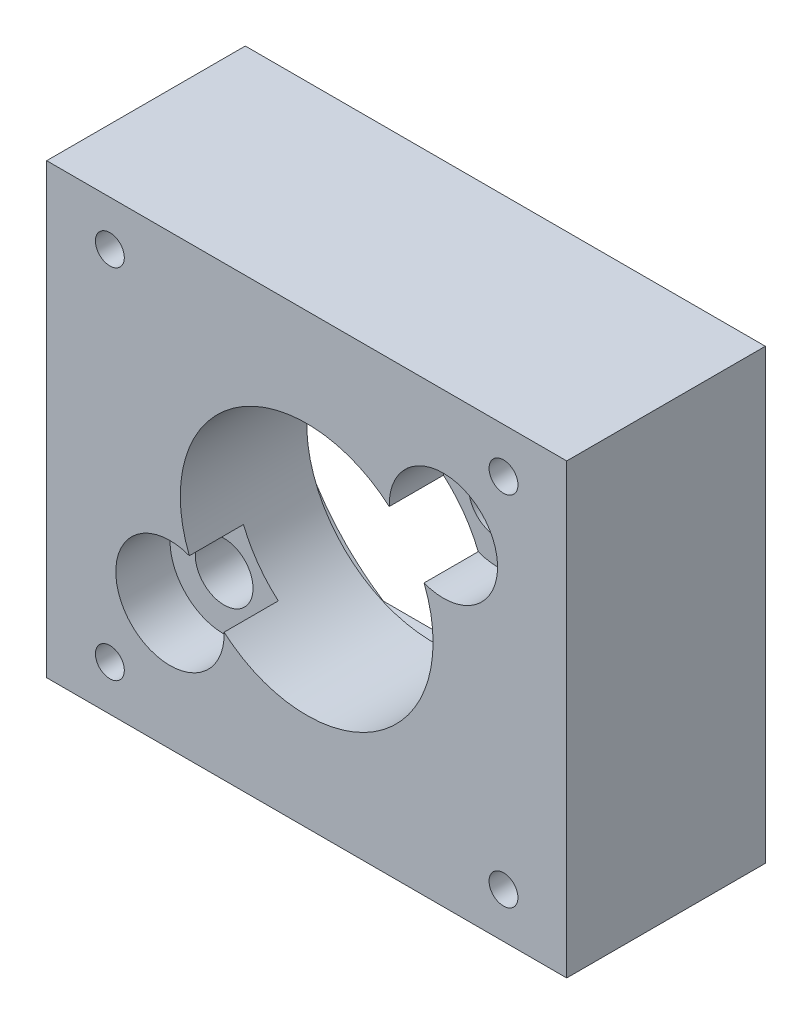
ISO-10303-21;
HEADER;
FILE_DESCRIPTION(('STEP AP214'),'2;1');
FILE_NAME('part.step','',(''),(''),'','','');
FILE_SCHEMA(('AUTOMOTIVE_DESIGN { 1 0 10303 214 1 1 1 1 }'));
ENDSEC;
DATA;
#1=APPLICATION_CONTEXT('core data for automotive mechanical design processes');
#2=APPLICATION_PROTOCOL_DEFINITION('international standard','automotive_design',2000,#1);
#3=PRODUCT_CONTEXT('',#1,'mechanical');
#4=PRODUCT('Part','Part','',(#3));
#5=PRODUCT_RELATED_PRODUCT_CATEGORY('part','',(#4));
#6=PRODUCT_DEFINITION_FORMATION('','',#4);
#7=PRODUCT_DEFINITION_CONTEXT('part definition',#1,'design');
#8=PRODUCT_DEFINITION('design','',#6,#7);
#9=PRODUCT_DEFINITION_SHAPE('','',#8);
#10=(LENGTH_UNIT() NAMED_UNIT(*) SI_UNIT(.MILLI.,.METRE.));
#11=(NAMED_UNIT(*) PLANE_ANGLE_UNIT() SI_UNIT($,.RADIAN.));
#12=(NAMED_UNIT(*) SI_UNIT($,.STERADIAN.) SOLID_ANGLE_UNIT());
#13=UNCERTAINTY_MEASURE_WITH_UNIT(LENGTH_MEASURE(1.E-05),#10,'distance_accuracy_value','');
#14=(GEOMETRIC_REPRESENTATION_CONTEXT(3) GLOBAL_UNCERTAINTY_ASSIGNED_CONTEXT((#13)) GLOBAL_UNIT_ASSIGNED_CONTEXT((#10,
#11,#12)) REPRESENTATION_CONTEXT('',''));
#15=CARTESIAN_POINT('',(0.,0.,0.));
#16=DIRECTION('',(0.,0.,1.));
#17=DIRECTION('',(1.,0.,0.));
#18=AXIS2_PLACEMENT_3D('',#15,#16,#17);
#19=CARTESIAN_POINT('',(3.78582883923719,2.7,0.));
#20=DIRECTION('',(0.,0.,1.));
#21=DIRECTION('',(1.,0.,0.));
#22=AXIS2_PLACEMENT_3D('',#19,#20,#21);
#23=CYLINDRICAL_SURFACE('',#22,0.799999999999999);
#24=CARTESIAN_POINT('',(3.78582883923719,2.7,0.));
#25=DIRECTION('',(0.,0.,1.));
#26=DIRECTION('',(1.,0.,0.));
#27=AXIS2_PLACEMENT_3D('',#24,#25,#26);
#28=CIRCLE('',#27,0.799999999999999);
#29=CARTESIAN_POINT('',(4.58582883923719,2.7,0.));
#30=VERTEX_POINT('',#29);
#31=EDGE_CURVE('E227',#30,#30,#28,.T.);
#32=ORIENTED_EDGE('',*,*,#31,.F.);
#33=EDGE_LOOP('',(#32));
#34=FACE_BOUND('',#33,.T.);
#35=CARTESIAN_POINT('',(3.78582883923719,2.7,2.));
#36=DIRECTION('',(0.,0.,1.));
#37=DIRECTION('',(1.,0.,0.));
#38=AXIS2_PLACEMENT_3D('',#35,#36,#37);
#39=CIRCLE('',#38,0.799999999999999);
#40=CARTESIAN_POINT('',(4.58582883923719,2.7,2.));
#41=VERTEX_POINT('',#40);
#42=EDGE_CURVE('E208',#41,#41,#39,.F.);
#43=ORIENTED_EDGE('',*,*,#42,.F.);
#44=EDGE_LOOP('',(#43));
#45=FACE_BOUND('',#44,.T.);
#46=ADVANCED_FACE('F51',(#34,#45),#23,.F.);
#47=CARTESIAN_POINT('',(-3.78582883923719,-2.7,0.));
#48=DIRECTION('',(0.,0.,1.));
#49=DIRECTION('',(1.,0.,0.));
#50=AXIS2_PLACEMENT_3D('',#47,#48,#49);
#51=CYLINDRICAL_SURFACE('',#50,0.8);
#52=CARTESIAN_POINT('',(-3.78582883923719,-2.7,0.));
#53=DIRECTION('',(0.,0.,1.));
#54=DIRECTION('',(1.,0.,0.));
#55=AXIS2_PLACEMENT_3D('',#52,#53,#54);
#56=CIRCLE('',#55,0.8);
#57=CARTESIAN_POINT('',(-2.98582883923719,-2.7,0.));
#58=VERTEX_POINT('',#57);
#59=EDGE_CURVE('E217',#58,#58,#56,.T.);
#60=ORIENTED_EDGE('',*,*,#59,.F.);
#61=EDGE_LOOP('',(#60));
#62=FACE_BOUND('',#61,.T.);
#63=CARTESIAN_POINT('',(-3.78582883923719,-2.7,2.));
#64=DIRECTION('',(0.,0.,1.));
#65=DIRECTION('',(1.,0.,0.));
#66=AXIS2_PLACEMENT_3D('',#63,#64,#65);
#67=CIRCLE('',#66,0.8);
#68=CARTESIAN_POINT('',(-2.98582883923719,-2.7,2.));
#69=VERTEX_POINT('',#68);
#70=EDGE_CURVE('E214',#69,#69,#67,.F.);
#71=ORIENTED_EDGE('',*,*,#70,.F.);
#72=EDGE_LOOP('',(#71));
#73=FACE_BOUND('',#72,.T.);
#74=ADVANCED_FACE('F277',(#62,#73),#51,.F.);
#75=CARTESIAN_POINT('',(7.2,6.2,3.5));
#76=DIRECTION('',(-1.,0.,0.));
#77=DIRECTION('',(0.,-1.,0.));
#78=AXIS2_PLACEMENT_3D('',#75,#76,#77);
#79=PLANE('',#78);
#80=DIRECTION('',(0.,0.,-1.));
#81=VECTOR('',#80,1.);
#82=CARTESIAN_POINT('',(7.2,-6.2,3.5));
#83=LINE('',#82,#81);
#84=CARTESIAN_POINT('',(7.2,-6.2,3.5));
#85=VERTEX_POINT('',#84);
#86=CARTESIAN_POINT('',(7.2,-6.2,-2.));
#87=VERTEX_POINT('',#86);
#88=EDGE_CURVE('E238',#85,#87,#83,.T.);
#89=ORIENTED_EDGE('',*,*,#88,.T.);
#90=DIRECTION('',(0.,-1.,0.));
#91=VECTOR('',#90,1.);
#92=CARTESIAN_POINT('',(7.2,0.,-2.));
#93=LINE('',#92,#91);
#94=CARTESIAN_POINT('',(7.2,6.2,-2.));
#95=VERTEX_POINT('',#94);
#96=EDGE_CURVE('E159',#95,#87,#93,.T.);
#97=ORIENTED_EDGE('',*,*,#96,.F.);
#98=DIRECTION('',(0.,0.,-1.));
#99=VECTOR('',#98,1.);
#100=CARTESIAN_POINT('',(7.2,6.2,3.5));
#101=LINE('',#100,#99);
#102=CARTESIAN_POINT('',(7.2,6.2,3.5));
#103=VERTEX_POINT('',#102);
#104=EDGE_CURVE('E149',#103,#95,#101,.T.);
#105=ORIENTED_EDGE('',*,*,#104,.F.);
#106=DIRECTION('',(0.,1.,0.));
#107=VECTOR('',#106,1.);
#108=CARTESIAN_POINT('',(7.2,6.2,3.5));
#109=LINE('',#108,#107);
#110=EDGE_CURVE('E230',#85,#103,#109,.T.);
#111=ORIENTED_EDGE('',*,*,#110,.F.);
#112=EDGE_LOOP('',(#89,#97,#105,#111));
#113=FACE_BOUND('',#112,.T.);
#114=ADVANCED_FACE('F53',(#113),#79,.F.);
#115=CARTESIAN_POINT('',(-7.2,6.2,3.5));
#116=DIRECTION('',(0.,-1.,0.));
#117=DIRECTION('',(0.,0.,-1.));
#118=AXIS2_PLACEMENT_3D('',#115,#116,#117);
#119=PLANE('',#118);
#120=ORIENTED_EDGE('',*,*,#104,.T.);
#121=DIRECTION('',(1.,0.,0.));
#122=VECTOR('',#121,1.);
#123=CARTESIAN_POINT('',(0.,6.2,-2.));
#124=LINE('',#123,#122);
#125=CARTESIAN_POINT('',(-7.2,6.2,-2.));
#126=VERTEX_POINT('',#125);
#127=EDGE_CURVE('E153',#126,#95,#124,.T.);
#128=ORIENTED_EDGE('',*,*,#127,.F.);
#129=DIRECTION('',(0.,0.,-1.));
#130=VECTOR('',#129,1.);
#131=CARTESIAN_POINT('',(-7.2,6.2,3.5));
#132=LINE('',#131,#130);
#133=CARTESIAN_POINT('',(-7.2,6.2,3.5));
#134=VERTEX_POINT('',#133);
#135=EDGE_CURVE('E141',#134,#126,#132,.T.);
#136=ORIENTED_EDGE('',*,*,#135,.F.);
#137=DIRECTION('',(-1.,0.,0.));
#138=VECTOR('',#137,1.);
#139=CARTESIAN_POINT('',(-7.2,6.2,3.5));
#140=LINE('',#139,#138);
#141=EDGE_CURVE('E233',#103,#134,#140,.T.);
#142=ORIENTED_EDGE('',*,*,#141,.F.);
#143=EDGE_LOOP('',(#120,#128,#136,#142));
#144=FACE_BOUND('',#143,.T.);
#145=ADVANCED_FACE('F154',(#144),#119,.F.);
#146=CARTESIAN_POINT('',(-7.2,6.2,3.5));
#147=DIRECTION('',(1.,0.,0.));
#148=DIRECTION('',(0.,1.,0.));
#149=AXIS2_PLACEMENT_3D('',#146,#147,#148);
#150=PLANE('',#149);
#151=ORIENTED_EDGE('',*,*,#135,.T.);
#152=DIRECTION('',(0.,1.,0.));
#153=VECTOR('',#152,1.);
#154=CARTESIAN_POINT('',(-7.2,0.,-2.));
#155=LINE('',#154,#153);
#156=CARTESIAN_POINT('',(-7.2,-6.19999999999999,-2.));
#157=VERTEX_POINT('',#156);
#158=EDGE_CURVE('E146',#157,#126,#155,.T.);
#159=ORIENTED_EDGE('',*,*,#158,.F.);
#160=DIRECTION('',(0.,0.,-1.));
#161=VECTOR('',#160,1.);
#162=CARTESIAN_POINT('',(-7.2,-6.2,3.5));
#163=LINE('',#162,#161);
#164=CARTESIAN_POINT('',(-7.2,-6.2,3.5));
#165=VERTEX_POINT('',#164);
#166=EDGE_CURVE('E150',#165,#157,#163,.T.);
#167=ORIENTED_EDGE('',*,*,#166,.F.);
#168=DIRECTION('',(0.,-1.,0.));
#169=VECTOR('',#168,1.);
#170=CARTESIAN_POINT('',(-7.2,6.2,3.5));
#171=LINE('',#170,#169);
#172=EDGE_CURVE('E147',#134,#165,#171,.T.);
#173=ORIENTED_EDGE('',*,*,#172,.F.);
#174=EDGE_LOOP('',(#151,#159,#167,#173));
#175=FACE_BOUND('',#174,.T.);
#176=ADVANCED_FACE('F143',(#175),#150,.F.);
#177=CARTESIAN_POINT('',(-7.2,-6.2,3.5));
#178=DIRECTION('',(0.,1.,0.));
#179=DIRECTION('',(0.,0.,1.));
#180=AXIS2_PLACEMENT_3D('',#177,#178,#179);
#181=PLANE('',#180);
#182=ORIENTED_EDGE('',*,*,#166,.T.);
#183=DIRECTION('',(-1.,0.,0.));
#184=VECTOR('',#183,1.);
#185=CARTESIAN_POINT('',(0.,-6.2,-2.));
#186=LINE('',#185,#184);
#187=EDGE_CURVE('E165',#87,#157,#186,.T.);
#188=ORIENTED_EDGE('',*,*,#187,.F.);
#189=ORIENTED_EDGE('',*,*,#88,.F.);
#190=DIRECTION('',(1.,0.,0.));
#191=VECTOR('',#190,1.);
#192=CARTESIAN_POINT('',(-7.2,-6.2,3.5));
#193=LINE('',#192,#191);
#194=EDGE_CURVE('E236',#165,#85,#193,.T.);
#195=ORIENTED_EDGE('',*,*,#194,.F.);
#196=EDGE_LOOP('',(#182,#188,#189,#195));
#197=FACE_BOUND('',#196,.T.);
#198=ADVANCED_FACE('F291',(#197),#181,.F.);
#199=CARTESIAN_POINT('',(0.,0.,3.5));
#200=DIRECTION('',(0.,0.,1.));
#201=DIRECTION('',(1.,0.,0.));
#202=AXIS2_PLACEMENT_3D('',#199,#200,#201);
#203=PLANE('',#202);
#204=CARTESIAN_POINT('',(-5.45,-4.95,3.5));
#205=DIRECTION('',(0.,0.,1.));
#206=DIRECTION('',(1.,0.,0.));
#207=AXIS2_PLACEMENT_3D('',#204,#205,#206);
#208=CIRCLE('',#207,0.4);
#209=CARTESIAN_POINT('',(-5.05,-4.95,3.5));
#210=VERTEX_POINT('',#209);
#211=EDGE_CURVE('E516',#210,#210,#208,.T.);
#212=ORIENTED_EDGE('',*,*,#211,.F.);
#213=EDGE_LOOP('',(#212));
#214=FACE_BOUND('',#213,.T.);
#215=CARTESIAN_POINT('',(5.45,-4.95,3.5));
#216=DIRECTION('',(0.,0.,1.));
#217=DIRECTION('',(1.,0.,0.));
#218=AXIS2_PLACEMENT_3D('',#215,#216,#217);
#219=CIRCLE('',#218,0.4);
#220=CARTESIAN_POINT('',(5.85,-4.95,3.5));
#221=VERTEX_POINT('',#220);
#222=EDGE_CURVE('E518',#221,#221,#219,.T.);
#223=ORIENTED_EDGE('',*,*,#222,.F.);
#224=EDGE_LOOP('',(#223));
#225=FACE_BOUND('',#224,.T.);
#226=CARTESIAN_POINT('',(5.45,4.95,3.5));
#227=DIRECTION('',(0.,0.,1.));
#228=DIRECTION('',(1.,0.,0.));
#229=AXIS2_PLACEMENT_3D('',#226,#227,#228);
#230=CIRCLE('',#229,0.4);
#231=CARTESIAN_POINT('',(5.85,4.95,3.5));
#232=VERTEX_POINT('',#231);
#233=EDGE_CURVE('E529',#232,#232,#230,.T.);
#234=ORIENTED_EDGE('',*,*,#233,.F.);
#235=EDGE_LOOP('',(#234));
#236=FACE_BOUND('',#235,.T.);
#237=CARTESIAN_POINT('',(-5.45,4.95,3.5));
#238=DIRECTION('',(0.,0.,1.));
#239=DIRECTION('',(1.,0.,0.));
#240=AXIS2_PLACEMENT_3D('',#237,#238,#239);
#241=CIRCLE('',#240,0.4);
#242=CARTESIAN_POINT('',(-5.05,4.95,3.5));
#243=VERTEX_POINT('',#242);
#244=EDGE_CURVE('E171',#243,#243,#241,.T.);
#245=ORIENTED_EDGE('',*,*,#244,.F.);
#246=EDGE_LOOP('',(#245));
#247=FACE_BOUND('',#246,.T.);
#248=CARTESIAN_POINT('',(-3.78582883923719,-2.7,3.5));
#249=DIRECTION('',(0.,0.,1.));
#250=DIRECTION('',(1.,0.,0.));
#251=AXIS2_PLACEMENT_3D('',#248,#249,#250);
#252=CIRCLE('',#251,1.5);
#253=CARTESIAN_POINT('',(-3.25003253598943,-1.29895670251557,3.5));
#254=VERTEX_POINT('',#253);
#255=CARTESIAN_POINT('',(-2.28667101210991,-2.64974256907652,3.5));
#256=VERTEX_POINT('',#255);
#257=EDGE_CURVE('E204',#254,#256,#252,.T.);
#258=ORIENTED_EDGE('',*,*,#257,.F.);
#259=CARTESIAN_POINT('',(0.,0.,3.5));
#260=DIRECTION('',(0.,0.,1.));
#261=DIRECTION('',(1.,0.,0.));
#262=AXIS2_PLACEMENT_3D('',#259,#260,#261);
#263=CIRCLE('',#262,3.5);
#264=CARTESIAN_POINT('',(2.28667101210991,2.64974256907652,3.5));
#265=VERTEX_POINT('',#264);
#266=EDGE_CURVE('E224',#265,#254,#263,.T.);
#267=ORIENTED_EDGE('',*,*,#266,.F.);
#268=CARTESIAN_POINT('',(3.78582883923719,2.7,3.5));
#269=DIRECTION('',(0.,0.,1.));
#270=DIRECTION('',(1.,0.,0.));
#271=AXIS2_PLACEMENT_3D('',#268,#269,#270);
#272=CIRCLE('',#271,1.5);
#273=CARTESIAN_POINT('',(3.25003253598943,1.29895670251558,3.5));
#274=VERTEX_POINT('',#273);
#275=EDGE_CURVE('E206',#274,#265,#272,.T.);
#276=ORIENTED_EDGE('',*,*,#275,.F.);
#277=EDGE_CURVE('E221',#256,#274,#263,.T.);
#278=ORIENTED_EDGE('',*,*,#277,.F.);
#279=EDGE_LOOP('',(#258,#267,#276,#278));
#280=FACE_BOUND('',#279,.T.);
#281=ORIENTED_EDGE('',*,*,#110,.T.);
#282=ORIENTED_EDGE('',*,*,#141,.T.);
#283=ORIENTED_EDGE('',*,*,#172,.T.);
#284=ORIENTED_EDGE('',*,*,#194,.T.);
#285=EDGE_LOOP('',(#281,#282,#283,#284));
#286=FACE_BOUND('',#285,.T.);
#287=ADVANCED_FACE('F262',(#214,#225,#236,#247,#280,#286),#203,.T.);
#288=CARTESIAN_POINT('',(0.,0.,0.));
#289=DIRECTION('',(0.,0.,1.));
#290=DIRECTION('',(1.,0.,0.));
#291=AXIS2_PLACEMENT_3D('',#288,#289,#290);
#292=PLANE('',#291);
#293=DIRECTION('',(-1.,0.,0.));
#294=VECTOR('',#293,1.);
#295=CARTESIAN_POINT('',(0.,5.2,0.));
#296=LINE('',#295,#294);
#297=CARTESIAN_POINT('',(3.37638860322682,5.2,0.));
#298=VERTEX_POINT('',#297);
#299=CARTESIAN_POINT('',(-3.37638860322682,5.2,0.));
#300=VERTEX_POINT('',#299);
#301=EDGE_CURVE('E188',#298,#300,#296,.T.);
#302=ORIENTED_EDGE('',*,*,#301,.F.);
#303=CARTESIAN_POINT('',(0.,0.,0.));
#304=DIRECTION('',(0.,0.,-1.));
#305=DIRECTION('',(-1.,0.,0.));
#306=AXIS2_PLACEMENT_3D('',#303,#304,#305);
#307=CIRCLE('',#306,6.2);
#308=CARTESIAN_POINT('',(3.37638860322682,-5.2,0.));
#309=VERTEX_POINT('',#308);
#310=EDGE_CURVE('E166',#298,#309,#307,.T.);
#311=ORIENTED_EDGE('',*,*,#310,.T.);
#312=DIRECTION('',(-1.,0.,0.));
#313=VECTOR('',#312,1.);
#314=CARTESIAN_POINT('',(0.,-5.2,0.));
#315=LINE('',#314,#313);
#316=CARTESIAN_POINT('',(-3.37638860322682,-5.2,0.));
#317=VERTEX_POINT('',#316);
#318=EDGE_CURVE('E66',#309,#317,#315,.T.);
#319=ORIENTED_EDGE('',*,*,#318,.T.);
#320=CARTESIAN_POINT('',(0.,0.,0.));
#321=DIRECTION('',(0.,0.,-1.));
#322=DIRECTION('',(-1.,0.,0.));
#323=AXIS2_PLACEMENT_3D('',#320,#321,#322);
#324=CIRCLE('',#323,6.2);
#325=EDGE_CURVE('E191',#317,#300,#324,.T.);
#326=ORIENTED_EDGE('',*,*,#325,.T.);
#327=EDGE_LOOP('',(#302,#311,#319,#326));
#328=FACE_BOUND('',#327,.T.);
#329=CARTESIAN_POINT('',(0.,0.,0.));
#330=DIRECTION('',(0.,0.,1.));
#331=DIRECTION('',(1.,0.,0.));
#332=AXIS2_PLACEMENT_3D('',#329,#330,#331);
#333=CIRCLE('',#332,3.5);
#334=CARTESIAN_POINT('',(3.5,0.,0.));
#335=VERTEX_POINT('',#334);
#336=EDGE_CURVE('E220',#335,#335,#333,.T.);
#337=ORIENTED_EDGE('',*,*,#336,.T.);
#338=EDGE_LOOP('',(#337));
#339=FACE_BOUND('',#338,.T.);
#340=ORIENTED_EDGE('',*,*,#59,.T.);
#341=EDGE_LOOP('',(#340));
#342=FACE_BOUND('',#341,.T.);
#343=ORIENTED_EDGE('',*,*,#31,.T.);
#344=EDGE_LOOP('',(#343));
#345=FACE_BOUND('',#344,.T.);
#346=ADVANCED_FACE('F290',(#328,#339,#342,#345),#292,.F.);
#347=CARTESIAN_POINT('',(0.,0.,0.));
#348=DIRECTION('',(0.,0.,1.));
#349=DIRECTION('',(1.,0.,0.));
#350=AXIS2_PLACEMENT_3D('',#347,#348,#349);
#351=CYLINDRICAL_SURFACE('',#350,3.5);
#352=ORIENTED_EDGE('',*,*,#336,.F.);
#353=EDGE_LOOP('',(#352));
#354=FACE_BOUND('',#353,.T.);
#355=CARTESIAN_POINT('',(0.,0.,2.));
#356=DIRECTION('',(0.,0.,1.));
#357=DIRECTION('',(1.,0.,0.));
#358=AXIS2_PLACEMENT_3D('',#355,#356,#357);
#359=CIRCLE('',#358,3.5);
#360=CARTESIAN_POINT('',(-2.28667101210991,-2.64974256907652,2.));
#361=VERTEX_POINT('',#360);
#362=CARTESIAN_POINT('',(-3.25003253598943,-1.29895670251557,2.));
#363=VERTEX_POINT('',#362);
#364=EDGE_CURVE('E250',#361,#363,#359,.F.);
#365=ORIENTED_EDGE('',*,*,#364,.F.);
#366=DIRECTION('',(0.,0.,1.));
#367=VECTOR('',#366,1.);
#368=CARTESIAN_POINT('',(-2.28667101210991,-2.64974256907652,2.75));
#369=LINE('',#368,#367);
#370=EDGE_CURVE('E13',#361,#256,#369,.T.);
#371=ORIENTED_EDGE('',*,*,#370,.T.);
#372=ORIENTED_EDGE('',*,*,#277,.T.);
#373=DIRECTION('',(0.,0.,1.));
#374=VECTOR('',#373,1.);
#375=CARTESIAN_POINT('',(3.25003253598943,1.29895670251558,2.75));
#376=LINE('',#375,#374);
#377=CARTESIAN_POINT('',(3.25003253598943,1.29895670251558,2.));
#378=VERTEX_POINT('',#377);
#379=EDGE_CURVE('E244',#274,#378,#376,.F.);
#380=ORIENTED_EDGE('',*,*,#379,.T.);
#381=CARTESIAN_POINT('',(0.,0.,2.));
#382=DIRECTION('',(0.,0.,1.));
#383=DIRECTION('',(1.,0.,0.));
#384=AXIS2_PLACEMENT_3D('',#381,#382,#383);
#385=CIRCLE('',#384,3.5);
#386=CARTESIAN_POINT('',(2.28667101210991,2.64974256907652,2.));
#387=VERTEX_POINT('',#386);
#388=EDGE_CURVE('E242',#387,#378,#385,.F.);
#389=ORIENTED_EDGE('',*,*,#388,.F.);
#390=DIRECTION('',(0.,0.,1.));
#391=VECTOR('',#390,1.);
#392=CARTESIAN_POINT('',(2.28667101210991,2.64974256907652,2.75));
#393=LINE('',#392,#391);
#394=EDGE_CURVE('E247',#387,#265,#393,.T.);
#395=ORIENTED_EDGE('',*,*,#394,.T.);
#396=ORIENTED_EDGE('',*,*,#266,.T.);
#397=DIRECTION('',(0.,0.,1.));
#398=VECTOR('',#397,1.);
#399=CARTESIAN_POINT('',(-3.25003253598943,-1.29895670251557,2.75));
#400=LINE('',#399,#398);
#401=EDGE_CURVE('E59',#254,#363,#400,.F.);
#402=ORIENTED_EDGE('',*,*,#401,.T.);
#403=EDGE_LOOP('',(#365,#371,#372,#380,#389,#395,#396,#402));
#404=FACE_BOUND('',#403,.T.);
#405=ADVANCED_FACE('F255',(#354,#404),#351,.F.);
#406=CARTESIAN_POINT('',(3.78582883923719,2.7,-4.24264068711929));
#407=DIRECTION('',(0.,0.,1.));
#408=DIRECTION('',(1.,0.,0.));
#409=AXIS2_PLACEMENT_3D('',#406,#407,#408);
#410=CYLINDRICAL_SURFACE('',#409,1.5);
#411=CARTESIAN_POINT('',(3.78582883923719,2.7,2.));
#412=DIRECTION('',(0.,0.,1.));
#413=DIRECTION('',(1.,0.,0.));
#414=AXIS2_PLACEMENT_3D('',#411,#412,#413);
#415=CIRCLE('',#414,1.5);
#416=EDGE_CURVE('E203',#387,#378,#415,.F.);
#417=ORIENTED_EDGE('',*,*,#416,.T.);
#418=ORIENTED_EDGE('',*,*,#379,.F.);
#419=ORIENTED_EDGE('',*,*,#275,.T.);
#420=ORIENTED_EDGE('',*,*,#394,.F.);
#421=EDGE_LOOP('',(#417,#418,#419,#420));
#422=FACE_BOUND('',#421,.T.);
#423=ADVANCED_FACE('F267',(#422),#410,.F.);
#424=CARTESIAN_POINT('',(0.,0.,2.));
#425=DIRECTION('',(0.,0.,1.));
#426=DIRECTION('',(1.,0.,0.));
#427=AXIS2_PLACEMENT_3D('',#424,#425,#426);
#428=PLANE('',#427);
#429=ORIENTED_EDGE('',*,*,#388,.T.);
#430=ORIENTED_EDGE('',*,*,#416,.F.);
#431=EDGE_LOOP('',(#429,#430));
#432=FACE_BOUND('',#431,.T.);
#433=ORIENTED_EDGE('',*,*,#42,.T.);
#434=EDGE_LOOP('',(#433));
#435=FACE_BOUND('',#434,.T.);
#436=ADVANCED_FACE('F270',(#432,#435),#428,.T.);
#437=CARTESIAN_POINT('',(-3.78582883923719,-2.7,-4.24264068711929));
#438=DIRECTION('',(0.,0.,1.));
#439=DIRECTION('',(1.,0.,0.));
#440=AXIS2_PLACEMENT_3D('',#437,#438,#439);
#441=CYLINDRICAL_SURFACE('',#440,1.5);
#442=CARTESIAN_POINT('',(-3.78582883923719,-2.7,2.));
#443=DIRECTION('',(0.,0.,1.));
#444=DIRECTION('',(1.,0.,0.));
#445=AXIS2_PLACEMENT_3D('',#442,#443,#444);
#446=CIRCLE('',#445,1.5);
#447=EDGE_CURVE('E73',#361,#363,#446,.F.);
#448=ORIENTED_EDGE('',*,*,#447,.T.);
#449=ORIENTED_EDGE('',*,*,#401,.F.);
#450=ORIENTED_EDGE('',*,*,#257,.T.);
#451=ORIENTED_EDGE('',*,*,#370,.F.);
#452=EDGE_LOOP('',(#448,#449,#450,#451));
#453=FACE_BOUND('',#452,.T.);
#454=ADVANCED_FACE('F259',(#453),#441,.F.);
#455=CARTESIAN_POINT('',(0.,0.,2.));
#456=DIRECTION('',(0.,0.,1.));
#457=DIRECTION('',(1.,0.,0.));
#458=AXIS2_PLACEMENT_3D('',#455,#456,#457);
#459=PLANE('',#458);
#460=ORIENTED_EDGE('',*,*,#364,.T.);
#461=ORIENTED_EDGE('',*,*,#447,.F.);
#462=EDGE_LOOP('',(#460,#461));
#463=FACE_BOUND('',#462,.T.);
#464=ORIENTED_EDGE('',*,*,#70,.T.);
#465=EDGE_LOOP('',(#464));
#466=FACE_BOUND('',#465,.T.);
#467=ADVANCED_FACE('F348',(#463,#466),#459,.T.);
#468=CARTESIAN_POINT('',(0.,5.2,-2.));
#469=DIRECTION('',(0.,1.,0.));
#470=DIRECTION('',(0.,0.,1.));
#471=AXIS2_PLACEMENT_3D('',#468,#469,#470);
#472=PLANE('',#471);
#473=ORIENTED_EDGE('',*,*,#301,.T.);
#474=DIRECTION('',(0.,0.,1.));
#475=VECTOR('',#474,1.);
#476=CARTESIAN_POINT('',(-3.37638860322682,5.2,-2.));
#477=LINE('',#476,#475);
#478=CARTESIAN_POINT('',(-3.37638860322682,5.2,-2.));
#479=VERTEX_POINT('',#478);
#480=EDGE_CURVE('E201',#479,#300,#477,.T.);
#481=ORIENTED_EDGE('',*,*,#480,.F.);
#482=DIRECTION('',(-1.,0.,0.));
#483=VECTOR('',#482,1.);
#484=CARTESIAN_POINT('',(0.,5.2,-2.));
#485=LINE('',#484,#483);
#486=CARTESIAN_POINT('',(3.37638860322682,5.2,-2.));
#487=VERTEX_POINT('',#486);
#488=EDGE_CURVE('E176',#487,#479,#485,.T.);
#489=ORIENTED_EDGE('',*,*,#488,.F.);
#490=DIRECTION('',(0.,0.,1.));
#491=VECTOR('',#490,1.);
#492=CARTESIAN_POINT('',(3.37638860322682,5.2,-2.));
#493=LINE('',#492,#491);
#494=EDGE_CURVE('E187',#487,#298,#493,.T.);
#495=ORIENTED_EDGE('',*,*,#494,.T.);
#496=EDGE_LOOP('',(#473,#481,#489,#495));
#497=FACE_BOUND('',#496,.T.);
#498=ADVANCED_FACE('F356',(#497),#472,.F.);
#499=CARTESIAN_POINT('',(0.,0.,-2.));
#500=DIRECTION('',(0.,0.,1.));
#501=DIRECTION('',(1.,0.,0.));
#502=AXIS2_PLACEMENT_3D('',#499,#500,#501);
#503=CYLINDRICAL_SURFACE('',#502,6.2);
#504=ORIENTED_EDGE('',*,*,#325,.F.);
#505=DIRECTION('',(0.,0.,1.));
#506=VECTOR('',#505,1.);
#507=CARTESIAN_POINT('',(-3.37638860322682,-5.2,-2.));
#508=LINE('',#507,#506);
#509=CARTESIAN_POINT('',(-3.37638860322682,-5.2,-2.));
#510=VERTEX_POINT('',#509);
#511=EDGE_CURVE('E199',#510,#317,#508,.T.);
#512=ORIENTED_EDGE('',*,*,#511,.F.);
#513=CARTESIAN_POINT('',(0.,0.,-2.));
#514=DIRECTION('',(0.,0.,-1.));
#515=DIRECTION('',(-1.,0.,0.));
#516=AXIS2_PLACEMENT_3D('',#513,#514,#515);
#517=CIRCLE('',#516,6.2);
#518=EDGE_CURVE('E178',#510,#479,#517,.T.);
#519=ORIENTED_EDGE('',*,*,#518,.T.);
#520=ORIENTED_EDGE('',*,*,#480,.T.);
#521=EDGE_LOOP('',(#504,#512,#519,#520));
#522=FACE_BOUND('',#521,.T.);
#523=ADVANCED_FACE('F365',(#522),#503,.F.);
#524=CARTESIAN_POINT('',(0.,-5.2,-2.));
#525=DIRECTION('',(0.,1.,0.));
#526=DIRECTION('',(0.,0.,1.));
#527=AXIS2_PLACEMENT_3D('',#524,#525,#526);
#528=PLANE('',#527);
#529=ORIENTED_EDGE('',*,*,#318,.F.);
#530=DIRECTION('',(0.,0.,1.));
#531=VECTOR('',#530,1.);
#532=CARTESIAN_POINT('',(3.37638860322682,-5.2,-2.));
#533=LINE('',#532,#531);
#534=CARTESIAN_POINT('',(3.37638860322682,-5.2,-2.));
#535=VERTEX_POINT('',#534);
#536=EDGE_CURVE('E197',#535,#309,#533,.T.);
#537=ORIENTED_EDGE('',*,*,#536,.F.);
#538=DIRECTION('',(-1.,0.,0.));
#539=VECTOR('',#538,1.);
#540=CARTESIAN_POINT('',(0.,-5.2,-2.));
#541=LINE('',#540,#539);
#542=EDGE_CURVE('E181',#535,#510,#541,.T.);
#543=ORIENTED_EDGE('',*,*,#542,.T.);
#544=ORIENTED_EDGE('',*,*,#511,.T.);
#545=EDGE_LOOP('',(#529,#537,#543,#544));
#546=FACE_BOUND('',#545,.T.);
#547=ADVANCED_FACE('F374',(#546),#528,.T.);
#548=CARTESIAN_POINT('',(0.,0.,-2.));
#549=DIRECTION('',(0.,0.,1.));
#550=DIRECTION('',(1.,0.,0.));
#551=AXIS2_PLACEMENT_3D('',#548,#549,#550);
#552=CYLINDRICAL_SURFACE('',#551,6.2);
#553=ORIENTED_EDGE('',*,*,#310,.F.);
#554=ORIENTED_EDGE('',*,*,#494,.F.);
#555=CARTESIAN_POINT('',(0.,0.,-2.));
#556=DIRECTION('',(0.,0.,-1.));
#557=DIRECTION('',(-1.,0.,0.));
#558=AXIS2_PLACEMENT_3D('',#555,#556,#557);
#559=CIRCLE('',#558,6.2);
#560=EDGE_CURVE('E184',#487,#535,#559,.T.);
#561=ORIENTED_EDGE('',*,*,#560,.T.);
#562=ORIENTED_EDGE('',*,*,#536,.T.);
#563=EDGE_LOOP('',(#553,#554,#561,#562));
#564=FACE_BOUND('',#563,.T.);
#565=ADVANCED_FACE('F382',(#564),#552,.F.);
#566=CARTESIAN_POINT('',(0.,0.,-2.));
#567=DIRECTION('',(0.,0.,-1.));
#568=DIRECTION('',(-1.,0.,0.));
#569=AXIS2_PLACEMENT_3D('',#566,#567,#568);
#570=PLANE('',#569);
#571=CARTESIAN_POINT('',(-5.45,-4.95,-2.));
#572=DIRECTION('',(0.,0.,1.));
#573=DIRECTION('',(1.,0.,0.));
#574=AXIS2_PLACEMENT_3D('',#571,#572,#573);
#575=CIRCLE('',#574,0.4);
#576=CARTESIAN_POINT('',(-5.05,-4.95,-2.));
#577=VERTEX_POINT('',#576);
#578=EDGE_CURVE('E513',#577,#577,#575,.T.);
#579=ORIENTED_EDGE('',*,*,#578,.T.);
#580=EDGE_LOOP('',(#579));
#581=FACE_BOUND('',#580,.T.);
#582=CARTESIAN_POINT('',(5.45,-4.95,-2.));
#583=DIRECTION('',(0.,0.,1.));
#584=DIRECTION('',(1.,0.,0.));
#585=AXIS2_PLACEMENT_3D('',#582,#583,#584);
#586=CIRCLE('',#585,0.4);
#587=CARTESIAN_POINT('',(5.85,-4.95,-2.));
#588=VERTEX_POINT('',#587);
#589=EDGE_CURVE('E534',#588,#588,#586,.T.);
#590=ORIENTED_EDGE('',*,*,#589,.T.);
#591=EDGE_LOOP('',(#590));
#592=FACE_BOUND('',#591,.T.);
#593=CARTESIAN_POINT('',(5.45,4.95,-2.));
#594=DIRECTION('',(0.,0.,1.));
#595=DIRECTION('',(1.,0.,0.));
#596=AXIS2_PLACEMENT_3D('',#593,#594,#595);
#597=CIRCLE('',#596,0.4);
#598=CARTESIAN_POINT('',(5.85,4.95,-2.));
#599=VERTEX_POINT('',#598);
#600=EDGE_CURVE('E525',#599,#599,#597,.T.);
#601=ORIENTED_EDGE('',*,*,#600,.T.);
#602=EDGE_LOOP('',(#601));
#603=FACE_BOUND('',#602,.T.);
#604=CARTESIAN_POINT('',(-5.45,4.95,-2.));
#605=DIRECTION('',(0.,0.,1.));
#606=DIRECTION('',(1.,0.,0.));
#607=AXIS2_PLACEMENT_3D('',#604,#605,#606);
#608=CIRCLE('',#607,0.4);
#609=CARTESIAN_POINT('',(-5.05,4.95,-2.));
#610=VERTEX_POINT('',#609);
#611=EDGE_CURVE('E192',#610,#610,#608,.T.);
#612=ORIENTED_EDGE('',*,*,#611,.T.);
#613=EDGE_LOOP('',(#612));
#614=FACE_BOUND('',#613,.T.);
#615=ORIENTED_EDGE('',*,*,#158,.T.);
#616=ORIENTED_EDGE('',*,*,#127,.T.);
#617=ORIENTED_EDGE('',*,*,#96,.T.);
#618=ORIENTED_EDGE('',*,*,#187,.T.);
#619=EDGE_LOOP('',(#615,#616,#617,#618));
#620=FACE_BOUND('',#619,.T.);
#621=ORIENTED_EDGE('',*,*,#488,.T.);
#622=ORIENTED_EDGE('',*,*,#518,.F.);
#623=ORIENTED_EDGE('',*,*,#542,.F.);
#624=ORIENTED_EDGE('',*,*,#560,.F.);
#625=EDGE_LOOP('',(#621,#622,#623,#624));
#626=FACE_BOUND('',#625,.T.);
#627=ADVANCED_FACE('F162',(#581,#592,#603,#614,#620,#626),#570,.T.);
#628=CARTESIAN_POINT('',(-5.45,4.95,-2.));
#629=DIRECTION('',(0.,0.,1.));
#630=DIRECTION('',(1.,0.,0.));
#631=AXIS2_PLACEMENT_3D('',#628,#629,#630);
#632=CYLINDRICAL_SURFACE('',#631,0.4);
#633=ORIENTED_EDGE('',*,*,#611,.F.);
#634=EDGE_LOOP('',(#633));
#635=FACE_BOUND('',#634,.T.);
#636=ORIENTED_EDGE('',*,*,#244,.T.);
#637=EDGE_LOOP('',(#636));
#638=FACE_BOUND('',#637,.T.);
#639=ADVANCED_FACE('F397',(#635,#638),#632,.F.);
#640=CARTESIAN_POINT('',(5.45,4.95,-2.));
#641=DIRECTION('',(0.,0.,1.));
#642=DIRECTION('',(1.,0.,0.));
#643=AXIS2_PLACEMENT_3D('',#640,#641,#642);
#644=CYLINDRICAL_SURFACE('',#643,0.4);
#645=ORIENTED_EDGE('',*,*,#600,.F.);
#646=EDGE_LOOP('',(#645));
#647=FACE_BOUND('',#646,.T.);
#648=ORIENTED_EDGE('',*,*,#233,.T.);
#649=EDGE_LOOP('',(#648));
#650=FACE_BOUND('',#649,.T.);
#651=ADVANCED_FACE('F405',(#647,#650),#644,.F.);
#652=CARTESIAN_POINT('',(5.45,-4.95,-2.));
#653=DIRECTION('',(0.,0.,1.));
#654=DIRECTION('',(1.,0.,0.));
#655=AXIS2_PLACEMENT_3D('',#652,#653,#654);
#656=CYLINDRICAL_SURFACE('',#655,0.4);
#657=ORIENTED_EDGE('',*,*,#589,.F.);
#658=EDGE_LOOP('',(#657));
#659=FACE_BOUND('',#658,.T.);
#660=ORIENTED_EDGE('',*,*,#222,.T.);
#661=EDGE_LOOP('',(#660));
#662=FACE_BOUND('',#661,.T.);
#663=ADVANCED_FACE('F413',(#659,#662),#656,.F.);
#664=CARTESIAN_POINT('',(-5.45,-4.95,-2.));
#665=DIRECTION('',(0.,0.,1.));
#666=DIRECTION('',(1.,0.,0.));
#667=AXIS2_PLACEMENT_3D('',#664,#665,#666);
#668=CYLINDRICAL_SURFACE('',#667,0.4);
#669=ORIENTED_EDGE('',*,*,#578,.F.);
#670=EDGE_LOOP('',(#669));
#671=FACE_BOUND('',#670,.T.);
#672=ORIENTED_EDGE('',*,*,#211,.T.);
#673=EDGE_LOOP('',(#672));
#674=FACE_BOUND('',#673,.T.);
#675=ADVANCED_FACE('F421',(#671,#674),#668,.F.);
#676=CLOSED_SHELL('',(#46,#74,#114,#145,#176,#198,#287,#346,#405,#423,#436,#454,#467,#498,#523,
#547,#565,#627,#639,#651,#663,#675));
#677=MANIFOLD_SOLID_BREP('B2',#676);
#678=ADVANCED_BREP_SHAPE_REPRESENTATION('',(#18,#677),#14);
#679=SHAPE_DEFINITION_REPRESENTATION(#9,#678);
ENDSEC;
END-ISO-10303-21;
